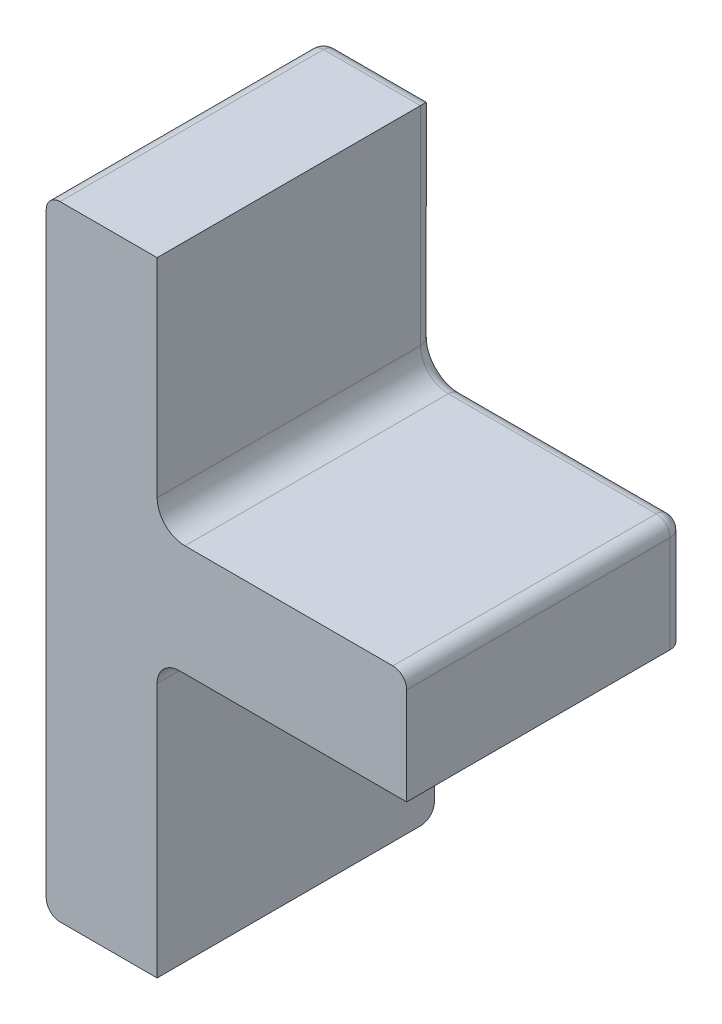
ISO-10303-21;
HEADER;
FILE_DESCRIPTION(('STEP AP214'),'2;1');
FILE_NAME('part.step','',(''),(''),'','','');
FILE_SCHEMA(('AUTOMOTIVE_DESIGN { 1 0 10303 214 1 1 1 1 }'));
ENDSEC;
DATA;
#1=APPLICATION_CONTEXT('core data for automotive mechanical design processes');
#2=APPLICATION_PROTOCOL_DEFINITION('international standard','automotive_design',2000,#1);
#3=PRODUCT_CONTEXT('',#1,'mechanical');
#4=PRODUCT('Part','Part','',(#3));
#5=PRODUCT_RELATED_PRODUCT_CATEGORY('part','',(#4));
#6=PRODUCT_DEFINITION_FORMATION('','',#4);
#7=PRODUCT_DEFINITION_CONTEXT('part definition',#1,'design');
#8=PRODUCT_DEFINITION('design','',#6,#7);
#9=PRODUCT_DEFINITION_SHAPE('','',#8);
#10=(LENGTH_UNIT() NAMED_UNIT(*) SI_UNIT(.MILLI.,.METRE.));
#11=(NAMED_UNIT(*) PLANE_ANGLE_UNIT() SI_UNIT($,.RADIAN.));
#12=(NAMED_UNIT(*) SI_UNIT($,.STERADIAN.) SOLID_ANGLE_UNIT());
#13=UNCERTAINTY_MEASURE_WITH_UNIT(LENGTH_MEASURE(1.E-05),#10,'distance_accuracy_value','');
#14=(GEOMETRIC_REPRESENTATION_CONTEXT(3) GLOBAL_UNCERTAINTY_ASSIGNED_CONTEXT((#13)) GLOBAL_UNIT_ASSIGNED_CONTEXT((#10,
#11,#12)) REPRESENTATION_CONTEXT('',''));
#15=CARTESIAN_POINT('',(0.,0.,0.));
#16=DIRECTION('',(0.,0.,1.));
#17=DIRECTION('',(1.,0.,0.));
#18=AXIS2_PLACEMENT_3D('',#15,#16,#17);
#19=CARTESIAN_POINT('',(10.16,0.,25.4));
#20=DIRECTION('',(0.,1.,0.));
#21=DIRECTION('',(0.,0.,1.));
#22=AXIS2_PLACEMENT_3D('',#19,#20,#21);
#23=PLANE('',#22);
#24=DIRECTION('',(0.,0.,-1.));
#25=VECTOR('',#24,1.);
#26=CARTESIAN_POINT('',(1.27,0.,25.4));
#27=LINE('',#26,#25);
#28=CARTESIAN_POINT('',(1.27,0.,25.4));
#29=VERTEX_POINT('',#28);
#30=CARTESIAN_POINT('',(1.27,0.,1.27));
#31=VERTEX_POINT('',#30);
#32=EDGE_CURVE('E219',#29,#31,#27,.T.);
#33=ORIENTED_EDGE('',*,*,#32,.T.);
#34=DIRECTION('',(1.,0.,0.));
#35=VECTOR('',#34,1.);
#36=CARTESIAN_POINT('',(10.16,0.,1.27));
#37=LINE('',#36,#35);
#38=CARTESIAN_POINT('',(10.16,0.,1.27));
#39=VERTEX_POINT('',#38);
#40=EDGE_CURVE('E175',#31,#39,#37,.T.);
#41=ORIENTED_EDGE('',*,*,#40,.T.);
#42=DIRECTION('',(0.,0.,-1.));
#43=VECTOR('',#42,1.);
#44=CARTESIAN_POINT('',(10.16,0.,25.4));
#45=LINE('',#44,#43);
#46=CARTESIAN_POINT('',(10.16,0.,25.4));
#47=VERTEX_POINT('',#46);
#48=EDGE_CURVE('E167',#47,#39,#45,.T.);
#49=ORIENTED_EDGE('',*,*,#48,.F.);
#50=DIRECTION('',(1.,0.,0.));
#51=VECTOR('',#50,1.);
#52=CARTESIAN_POINT('',(10.16,0.,25.4));
#53=LINE('',#52,#51);
#54=EDGE_CURVE('E150',#29,#47,#53,.T.);
#55=ORIENTED_EDGE('',*,*,#54,.F.);
#56=EDGE_LOOP('',(#33,#41,#49,#55));
#57=FACE_BOUND('',#56,.T.);
#58=ADVANCED_FACE('F33',(#57),#23,.F.);
#59=CARTESIAN_POINT('',(10.16,23.368,25.4));
#60=DIRECTION('',(-1.,0.,0.));
#61=DIRECTION('',(0.,0.,1.));
#62=AXIS2_PLACEMENT_3D('',#59,#60,#61);
#63=PLANE('',#62);
#64=ORIENTED_EDGE('',*,*,#48,.T.);
#65=CARTESIAN_POINT('',(10.16,1.27,1.27));
#66=DIRECTION('',(-1.,0.,0.));
#67=DIRECTION('',(0.,0.,1.));
#68=AXIS2_PLACEMENT_3D('',#65,#66,#67);
#69=CIRCLE('',#68,1.27);
#70=CARTESIAN_POINT('',(10.16,1.27000000000001,0.));
#71=VERTEX_POINT('',#70);
#72=EDGE_CURVE('E222',#39,#71,#69,.F.);
#73=ORIENTED_EDGE('',*,*,#72,.T.);
#74=DIRECTION('',(0.,1.,0.));
#75=VECTOR('',#74,1.);
#76=CARTESIAN_POINT('',(10.16,23.368,0.));
#77=LINE('',#76,#75);
#78=CARTESIAN_POINT('',(10.16,23.368,0.));
#79=VERTEX_POINT('',#78);
#80=EDGE_CURVE('E260',#71,#79,#77,.T.);
#81=ORIENTED_EDGE('',*,*,#80,.T.);
#82=DIRECTION('',(0.,0.,-1.));
#83=VECTOR('',#82,1.);
#84=CARTESIAN_POINT('',(10.16,23.368,25.4));
#85=LINE('',#84,#83);
#86=CARTESIAN_POINT('',(10.16,23.368,25.4));
#87=VERTEX_POINT('',#86);
#88=EDGE_CURVE('E170',#87,#79,#85,.T.);
#89=ORIENTED_EDGE('',*,*,#88,.F.);
#90=DIRECTION('',(0.,1.,0.));
#91=VECTOR('',#90,1.);
#92=CARTESIAN_POINT('',(10.16,23.368,25.4));
#93=LINE('',#92,#91);
#94=EDGE_CURVE('E154',#47,#87,#93,.T.);
#95=ORIENTED_EDGE('',*,*,#94,.F.);
#96=EDGE_LOOP('',(#64,#73,#81,#89,#95));
#97=FACE_BOUND('',#96,.T.);
#98=ADVANCED_FACE('F166',(#97),#63,.F.);
#99=CARTESIAN_POINT('',(12.192,23.368,25.4));
#100=DIRECTION('',(0.,0.,-1.));
#101=DIRECTION('',(-1.,0.,0.));
#102=AXIS2_PLACEMENT_3D('',#99,#100,#101);
#103=CYLINDRICAL_SURFACE('',#102,2.032);
#104=CARTESIAN_POINT('',(12.192,23.368,0.));
#105=DIRECTION('',(0.,0.,-1.));
#106=DIRECTION('',(1.,0.,0.));
#107=AXIS2_PLACEMENT_3D('',#104,#105,#106);
#108=CIRCLE('',#107,2.032);
#109=CARTESIAN_POINT('',(12.192,25.4,0.));
#110=VERTEX_POINT('',#109);
#111=EDGE_CURVE('E262',#79,#110,#108,.T.);
#112=ORIENTED_EDGE('',*,*,#111,.T.);
#113=DIRECTION('',(0.,0.,-1.));
#114=VECTOR('',#113,1.);
#115=CARTESIAN_POINT('',(12.192,25.4,25.4));
#116=LINE('',#115,#114);
#117=CARTESIAN_POINT('',(12.192,25.4,25.4));
#118=VERTEX_POINT('',#117);
#119=EDGE_CURVE('E181',#118,#110,#116,.T.);
#120=ORIENTED_EDGE('',*,*,#119,.F.);
#121=CARTESIAN_POINT('',(12.192,23.368,25.4));
#122=DIRECTION('',(0.,0.,-1.));
#123=DIRECTION('',(1.,0.,0.));
#124=AXIS2_PLACEMENT_3D('',#121,#122,#123);
#125=CIRCLE('',#124,2.032);
#126=EDGE_CURVE('E172',#87,#118,#125,.T.);
#127=ORIENTED_EDGE('',*,*,#126,.F.);
#128=ORIENTED_EDGE('',*,*,#88,.T.);
#129=EDGE_LOOP('',(#112,#120,#127,#128));
#130=FACE_BOUND('',#129,.T.);
#131=ADVANCED_FACE('F371',(#130),#103,.F.);
#132=CARTESIAN_POINT('',(33.02,25.4,25.4));
#133=DIRECTION('',(0.,1.,0.));
#134=DIRECTION('',(-1.,0.,0.));
#135=AXIS2_PLACEMENT_3D('',#132,#133,#134);
#136=PLANE('',#135);
#137=DIRECTION('',(1.,0.,0.));
#138=VECTOR('',#137,1.);
#139=CARTESIAN_POINT('',(33.02,25.4,0.));
#140=LINE('',#139,#138);
#141=CARTESIAN_POINT('',(31.75,25.4,0.));
#142=VERTEX_POINT('',#141);
#143=EDGE_CURVE('E162',#110,#142,#140,.T.);
#144=ORIENTED_EDGE('',*,*,#143,.T.);
#145=CARTESIAN_POINT('',(31.75,25.4,1.27));
#146=DIRECTION('',(0.,1.,0.));
#147=DIRECTION('',(-1.,0.,0.));
#148=AXIS2_PLACEMENT_3D('',#145,#146,#147);
#149=CIRCLE('',#148,1.27);
#150=CARTESIAN_POINT('',(33.02,25.4,1.27));
#151=VERTEX_POINT('',#150);
#152=EDGE_CURVE('E204',#142,#151,#149,.F.);
#153=ORIENTED_EDGE('',*,*,#152,.T.);
#154=DIRECTION('',(0.,0.,-1.));
#155=VECTOR('',#154,1.);
#156=CARTESIAN_POINT('',(33.02,25.4,25.4));
#157=LINE('',#156,#155);
#158=CARTESIAN_POINT('',(33.02,25.4,25.4));
#159=VERTEX_POINT('',#158);
#160=EDGE_CURVE('E281',#159,#151,#157,.T.);
#161=ORIENTED_EDGE('',*,*,#160,.F.);
#162=DIRECTION('',(1.,0.,0.));
#163=VECTOR('',#162,1.);
#164=CARTESIAN_POINT('',(33.02,25.4,25.4));
#165=LINE('',#164,#163);
#166=EDGE_CURVE('E291',#118,#159,#165,.T.);
#167=ORIENTED_EDGE('',*,*,#166,.F.);
#168=ORIENTED_EDGE('',*,*,#119,.T.);
#169=EDGE_LOOP('',(#144,#153,#161,#167,#168));
#170=FACE_BOUND('',#169,.T.);
#171=ADVANCED_FACE('F288',(#170),#136,.F.);
#172=CARTESIAN_POINT('',(33.02,35.56,25.4));
#173=DIRECTION('',(-1.,0.,0.));
#174=DIRECTION('',(0.,0.,1.));
#175=AXIS2_PLACEMENT_3D('',#172,#173,#174);
#176=PLANE('',#175);
#177=ORIENTED_EDGE('',*,*,#160,.T.);
#178=DIRECTION('',(0.,1.,0.));
#179=VECTOR('',#178,1.);
#180=CARTESIAN_POINT('',(33.02,35.56,1.27));
#181=LINE('',#180,#179);
#182=CARTESIAN_POINT('',(33.02,34.29,1.27));
#183=VERTEX_POINT('',#182);
#184=EDGE_CURVE('E202',#151,#183,#181,.T.);
#185=ORIENTED_EDGE('',*,*,#184,.T.);
#186=DIRECTION('',(0.,0.,-1.));
#187=VECTOR('',#186,1.);
#188=CARTESIAN_POINT('',(33.02,34.29,25.4));
#189=LINE('',#188,#187);
#190=CARTESIAN_POINT('',(33.02,34.29,25.4));
#191=VERTEX_POINT('',#190);
#192=EDGE_CURVE('E200',#183,#191,#189,.F.);
#193=ORIENTED_EDGE('',*,*,#192,.T.);
#194=DIRECTION('',(0.,1.,0.));
#195=VECTOR('',#194,1.);
#196=CARTESIAN_POINT('',(33.02,35.56,25.4));
#197=LINE('',#196,#195);
#198=EDGE_CURVE('E327',#159,#191,#197,.T.);
#199=ORIENTED_EDGE('',*,*,#198,.F.);
#200=EDGE_LOOP('',(#177,#185,#193,#199));
#201=FACE_BOUND('',#200,.T.);
#202=ADVANCED_FACE('F530',(#201),#176,.F.);
#203=CARTESIAN_POINT('',(12.7,35.56,25.4));
#204=DIRECTION('',(0.,-1.,0.));
#205=DIRECTION('',(0.,0.,-1.));
#206=AXIS2_PLACEMENT_3D('',#203,#204,#205);
#207=PLANE('',#206);
#208=DIRECTION('',(-1.,0.,0.));
#209=VECTOR('',#208,1.);
#210=CARTESIAN_POINT('',(12.7,35.56,25.4));
#211=LINE('',#210,#209);
#212=CARTESIAN_POINT('',(31.75,35.56,25.4));
#213=VERTEX_POINT('',#212);
#214=CARTESIAN_POINT('',(12.7,35.56,25.4));
#215=VERTEX_POINT('',#214);
#216=EDGE_CURVE('E323',#213,#215,#211,.T.);
#217=ORIENTED_EDGE('',*,*,#216,.F.);
#218=DIRECTION('',(0.,0.,-1.));
#219=VECTOR('',#218,1.);
#220=CARTESIAN_POINT('',(31.75,35.56,25.4));
#221=LINE('',#220,#219);
#222=CARTESIAN_POINT('',(31.75,35.56,1.27));
#223=VERTEX_POINT('',#222);
#224=EDGE_CURVE('E208',#213,#223,#221,.T.);
#225=ORIENTED_EDGE('',*,*,#224,.T.);
#226=DIRECTION('',(-1.,0.,0.));
#227=VECTOR('',#226,1.);
#228=CARTESIAN_POINT('',(12.7,35.56,1.27));
#229=LINE('',#228,#227);
#230=CARTESIAN_POINT('',(12.7,35.56,1.27));
#231=VERTEX_POINT('',#230);
#232=EDGE_CURVE('E206',#223,#231,#229,.T.);
#233=ORIENTED_EDGE('',*,*,#232,.T.);
#234=DIRECTION('',(0.,0.,-1.));
#235=VECTOR('',#234,1.);
#236=CARTESIAN_POINT('',(12.7,35.56,25.4));
#237=LINE('',#236,#235);
#238=EDGE_CURVE('E278',#215,#231,#237,.T.);
#239=ORIENTED_EDGE('',*,*,#238,.F.);
#240=EDGE_LOOP('',(#217,#225,#233,#239));
#241=FACE_BOUND('',#240,.T.);
#242=ADVANCED_FACE('F314',(#241),#207,.F.);
#243=CARTESIAN_POINT('',(12.7,38.1,25.4));
#244=DIRECTION('',(0.,0.,-1.));
#245=DIRECTION('',(-1.,0.,0.));
#246=AXIS2_PLACEMENT_3D('',#243,#244,#245);
#247=CYLINDRICAL_SURFACE('',#246,2.54);
#248=ORIENTED_EDGE('',*,*,#238,.T.);
#249=CARTESIAN_POINT('',(12.7,38.1,1.27));
#250=DIRECTION('',(0.,0.,1.));
#251=DIRECTION('',(1.,0.,0.));
#252=AXIS2_PLACEMENT_3D('',#249,#250,#251);
#253=CIRCLE('',#252,2.54);
#254=CARTESIAN_POINT('',(10.16,38.1,1.27));
#255=VERTEX_POINT('',#254);
#256=EDGE_CURVE('E198',#231,#255,#253,.F.);
#257=ORIENTED_EDGE('',*,*,#256,.T.);
#258=DIRECTION('',(0.,0.,-1.));
#259=VECTOR('',#258,1.);
#260=CARTESIAN_POINT('',(10.16,38.1,25.4));
#261=LINE('',#260,#259);
#262=CARTESIAN_POINT('',(10.16,38.1,25.4));
#263=VERTEX_POINT('',#262);
#264=EDGE_CURVE('E275',#263,#255,#261,.T.);
#265=ORIENTED_EDGE('',*,*,#264,.F.);
#266=CARTESIAN_POINT('',(12.7,38.1,25.4));
#267=DIRECTION('',(0.,0.,-1.));
#268=DIRECTION('',(1.,0.,0.));
#269=AXIS2_PLACEMENT_3D('',#266,#267,#268);
#270=CIRCLE('',#269,2.54);
#271=EDGE_CURVE('E320',#215,#263,#270,.T.);
#272=ORIENTED_EDGE('',*,*,#271,.F.);
#273=EDGE_LOOP('',(#248,#257,#265,#272));
#274=FACE_BOUND('',#273,.T.);
#275=ADVANCED_FACE('F318',(#274),#247,.F.);
#276=CARTESIAN_POINT('',(10.16,57.15,25.4));
#277=DIRECTION('',(-1.,0.,0.));
#278=DIRECTION('',(0.,-1.,0.));
#279=AXIS2_PLACEMENT_3D('',#276,#277,#278);
#280=PLANE('',#279);
#281=ORIENTED_EDGE('',*,*,#264,.T.);
#282=DIRECTION('',(0.,1.,0.));
#283=VECTOR('',#282,1.);
#284=CARTESIAN_POINT('',(10.16,57.15,1.27));
#285=LINE('',#284,#283);
#286=CARTESIAN_POINT('',(10.16,57.15,1.27));
#287=VERTEX_POINT('',#286);
#288=EDGE_CURVE('E176',#255,#287,#285,.T.);
#289=ORIENTED_EDGE('',*,*,#288,.T.);
#290=DIRECTION('',(0.,0.,-1.));
#291=VECTOR('',#290,1.);
#292=CARTESIAN_POINT('',(10.16,57.15,25.4));
#293=LINE('',#292,#291);
#294=CARTESIAN_POINT('',(10.16,57.15,25.4));
#295=VERTEX_POINT('',#294);
#296=EDGE_CURVE('E272',#295,#287,#293,.T.);
#297=ORIENTED_EDGE('',*,*,#296,.F.);
#298=DIRECTION('',(0.,1.,0.));
#299=VECTOR('',#298,1.);
#300=CARTESIAN_POINT('',(10.16,57.15,25.4));
#301=LINE('',#300,#299);
#302=EDGE_CURVE('E322',#263,#295,#301,.T.);
#303=ORIENTED_EDGE('',*,*,#302,.F.);
#304=EDGE_LOOP('',(#281,#289,#297,#303));
#305=FACE_BOUND('',#304,.T.);
#306=ADVANCED_FACE('F503',(#305),#280,.F.);
#307=CARTESIAN_POINT('',(0.,57.15,25.4));
#308=DIRECTION('',(0.,-1.,0.));
#309=DIRECTION('',(0.,0.,-1.));
#310=AXIS2_PLACEMENT_3D('',#307,#308,#309);
#311=PLANE('',#310);
#312=ORIENTED_EDGE('',*,*,#296,.T.);
#313=DIRECTION('',(-1.,0.,0.));
#314=VECTOR('',#313,1.);
#315=CARTESIAN_POINT('',(0.,57.15,1.27));
#316=LINE('',#315,#314);
#317=CARTESIAN_POINT('',(1.27,57.15,1.27));
#318=VERTEX_POINT('',#317);
#319=EDGE_CURVE('E217',#287,#318,#316,.T.);
#320=ORIENTED_EDGE('',*,*,#319,.T.);
#321=DIRECTION('',(0.,0.,-1.));
#322=VECTOR('',#321,1.);
#323=CARTESIAN_POINT('',(1.27,57.15,25.4));
#324=LINE('',#323,#322);
#325=CARTESIAN_POINT('',(1.27,57.15,25.4));
#326=VERTEX_POINT('',#325);
#327=EDGE_CURVE('E215',#318,#326,#324,.F.);
#328=ORIENTED_EDGE('',*,*,#327,.T.);
#329=DIRECTION('',(-1.,0.,0.));
#330=VECTOR('',#329,1.);
#331=CARTESIAN_POINT('',(0.,57.15,25.4));
#332=LINE('',#331,#330);
#333=EDGE_CURVE('E325',#295,#326,#332,.T.);
#334=ORIENTED_EDGE('',*,*,#333,.F.);
#335=EDGE_LOOP('',(#312,#320,#328,#334));
#336=FACE_BOUND('',#335,.T.);
#337=ADVANCED_FACE('F493',(#336),#311,.F.);
#338=CARTESIAN_POINT('',(0.,0.,25.4));
#339=DIRECTION('',(1.,0.,0.));
#340=DIRECTION('',(0.,0.,-1.));
#341=AXIS2_PLACEMENT_3D('',#338,#339,#340);
#342=PLANE('',#341);
#343=DIRECTION('',(0.,-1.,0.));
#344=VECTOR('',#343,1.);
#345=CARTESIAN_POINT('',(0.,0.,1.27));
#346=LINE('',#345,#344);
#347=CARTESIAN_POINT('',(0.,55.88,1.27));
#348=VERTEX_POINT('',#347);
#349=CARTESIAN_POINT('',(0.,1.27,1.27));
#350=VERTEX_POINT('',#349);
#351=EDGE_CURVE('E42',#348,#350,#346,.T.);
#352=ORIENTED_EDGE('',*,*,#351,.T.);
#353=DIRECTION('',(0.,0.,-1.));
#354=VECTOR('',#353,1.);
#355=CARTESIAN_POINT('',(0.,1.27,25.4));
#356=LINE('',#355,#354);
#357=CARTESIAN_POINT('',(0.,1.27,25.4));
#358=VERTEX_POINT('',#357);
#359=EDGE_CURVE('E11',#350,#358,#356,.F.);
#360=ORIENTED_EDGE('',*,*,#359,.T.);
#361=DIRECTION('',(0.,-1.,0.));
#362=VECTOR('',#361,1.);
#363=CARTESIAN_POINT('',(0.,35.56,25.4));
#364=LINE('',#363,#362);
#365=CARTESIAN_POINT('',(0.,55.88,25.4));
#366=VERTEX_POINT('',#365);
#367=EDGE_CURVE('E267',#366,#358,#364,.T.);
#368=ORIENTED_EDGE('',*,*,#367,.F.);
#369=DIRECTION('',(0.,0.,-1.));
#370=VECTOR('',#369,1.);
#371=CARTESIAN_POINT('',(0.,55.88,25.4));
#372=LINE('',#371,#370);
#373=EDGE_CURVE('E53',#366,#348,#372,.T.);
#374=ORIENTED_EDGE('',*,*,#373,.T.);
#375=EDGE_LOOP('',(#352,#360,#368,#374));
#376=FACE_BOUND('',#375,.T.);
#377=ADVANCED_FACE('F484',(#376),#342,.F.);
#378=CARTESIAN_POINT('',(12.7,38.1,25.4));
#379=DIRECTION('',(0.,0.,1.));
#380=DIRECTION('',(1.,0.,0.));
#381=AXIS2_PLACEMENT_3D('',#378,#379,#380);
#382=PLANE('',#381);
#383=ORIENTED_EDGE('',*,*,#198,.T.);
#384=CARTESIAN_POINT('',(31.75,34.29,25.4));
#385=DIRECTION('',(0.,0.,1.));
#386=DIRECTION('',(1.,0.,0.));
#387=AXIS2_PLACEMENT_3D('',#384,#385,#386);
#388=CIRCLE('',#387,1.27);
#389=EDGE_CURVE('E213',#191,#213,#388,.T.);
#390=ORIENTED_EDGE('',*,*,#389,.T.);
#391=ORIENTED_EDGE('',*,*,#216,.T.);
#392=ORIENTED_EDGE('',*,*,#271,.T.);
#393=ORIENTED_EDGE('',*,*,#302,.T.);
#394=ORIENTED_EDGE('',*,*,#333,.T.);
#395=CARTESIAN_POINT('',(1.27,55.88,25.4));
#396=DIRECTION('',(0.,0.,1.));
#397=DIRECTION('',(1.,0.,0.));
#398=AXIS2_PLACEMENT_3D('',#395,#396,#397);
#399=CIRCLE('',#398,1.27);
#400=EDGE_CURVE('E210',#326,#366,#399,.T.);
#401=ORIENTED_EDGE('',*,*,#400,.T.);
#402=ORIENTED_EDGE('',*,*,#367,.T.);
#403=CARTESIAN_POINT('',(1.27,1.27,25.4));
#404=DIRECTION('',(0.,0.,1.));
#405=DIRECTION('',(1.,0.,0.));
#406=AXIS2_PLACEMENT_3D('',#403,#404,#405);
#407=CIRCLE('',#406,1.27);
#408=EDGE_CURVE('E158',#358,#29,#407,.T.);
#409=ORIENTED_EDGE('',*,*,#408,.T.);
#410=ORIENTED_EDGE('',*,*,#54,.T.);
#411=ORIENTED_EDGE('',*,*,#94,.T.);
#412=ORIENTED_EDGE('',*,*,#126,.T.);
#413=ORIENTED_EDGE('',*,*,#166,.T.);
#414=EDGE_LOOP('',(#383,#390,#391,#392,#393,#394,#401,#402,#409,#410,#411,#412,#413));
#415=FACE_BOUND('',#414,.T.);
#416=ADVANCED_FACE('F153',(#415),#382,.T.);
#417=CARTESIAN_POINT('',(12.7,38.1,0.));
#418=DIRECTION('',(0.,0.,1.));
#419=DIRECTION('',(1.,0.,0.));
#420=AXIS2_PLACEMENT_3D('',#417,#418,#419);
#421=PLANE('',#420);
#422=DIRECTION('',(-1.,0.,0.));
#423=VECTOR('',#422,1.);
#424=CARTESIAN_POINT('',(12.7,34.29,0.));
#425=LINE('',#424,#423);
#426=CARTESIAN_POINT('',(12.7,34.29,0.));
#427=VERTEX_POINT('',#426);
#428=CARTESIAN_POINT('',(31.75,34.29,0.));
#429=VERTEX_POINT('',#428);
#430=EDGE_CURVE('E194',#427,#429,#425,.F.);
#431=ORIENTED_EDGE('',*,*,#430,.T.);
#432=DIRECTION('',(0.,1.,0.));
#433=VECTOR('',#432,1.);
#434=CARTESIAN_POINT('',(31.75,38.1,0.));
#435=LINE('',#434,#433);
#436=EDGE_CURVE('E196',#429,#142,#435,.F.);
#437=ORIENTED_EDGE('',*,*,#436,.T.);
#438=ORIENTED_EDGE('',*,*,#143,.F.);
#439=ORIENTED_EDGE('',*,*,#111,.F.);
#440=ORIENTED_EDGE('',*,*,#80,.F.);
#441=DIRECTION('',(1.,0.,0.));
#442=VECTOR('',#441,1.);
#443=CARTESIAN_POINT('',(12.7,1.27,0.));
#444=LINE('',#443,#442);
#445=CARTESIAN_POINT('',(1.27,1.27,0.));
#446=VERTEX_POINT('',#445);
#447=EDGE_CURVE('E186',#71,#446,#444,.F.);
#448=ORIENTED_EDGE('',*,*,#447,.T.);
#449=DIRECTION('',(0.,-1.,0.));
#450=VECTOR('',#449,1.);
#451=CARTESIAN_POINT('',(1.27,38.1,0.));
#452=LINE('',#451,#450);
#453=CARTESIAN_POINT('',(1.27,55.88,0.));
#454=VERTEX_POINT('',#453);
#455=EDGE_CURVE('E179',#446,#454,#452,.F.);
#456=ORIENTED_EDGE('',*,*,#455,.T.);
#457=DIRECTION('',(-1.,0.,0.));
#458=VECTOR('',#457,1.);
#459=CARTESIAN_POINT('',(12.7,55.88,0.));
#460=LINE('',#459,#458);
#461=CARTESIAN_POINT('',(8.89,55.88,0.));
#462=VERTEX_POINT('',#461);
#463=EDGE_CURVE('E188',#454,#462,#460,.F.);
#464=ORIENTED_EDGE('',*,*,#463,.T.);
#465=DIRECTION('',(0.,1.,0.));
#466=VECTOR('',#465,1.);
#467=CARTESIAN_POINT('',(8.89,38.1,0.));
#468=LINE('',#467,#466);
#469=CARTESIAN_POINT('',(8.89,38.1,0.));
#470=VERTEX_POINT('',#469);
#471=EDGE_CURVE('E190',#462,#470,#468,.F.);
#472=ORIENTED_EDGE('',*,*,#471,.T.);
#473=CARTESIAN_POINT('',(12.7,38.1,0.));
#474=DIRECTION('',(0.,0.,1.));
#475=DIRECTION('',(1.,0.,0.));
#476=AXIS2_PLACEMENT_3D('',#473,#474,#475);
#477=CIRCLE('',#476,3.81);
#478=EDGE_CURVE('E192',#470,#427,#477,.T.);
#479=ORIENTED_EDGE('',*,*,#478,.T.);
#480=EDGE_LOOP('',(#431,#437,#438,#439,#440,#448,#456,#464,#472,#479));
#481=FACE_BOUND('',#480,.T.);
#482=ADVANCED_FACE('F295',(#481),#421,.F.);
#483=CARTESIAN_POINT('',(1.27,1.27,25.4));
#484=DIRECTION('',(0.,0.,-1.));
#485=DIRECTION('',(-1.,0.,0.));
#486=AXIS2_PLACEMENT_3D('',#483,#484,#485);
#487=CYLINDRICAL_SURFACE('',#486,1.27);
#488=ORIENTED_EDGE('',*,*,#408,.F.);
#489=ORIENTED_EDGE('',*,*,#359,.F.);
#490=CARTESIAN_POINT('',(1.27,1.27,1.27));
#491=DIRECTION('',(0.,0.,-1.));
#492=DIRECTION('',(-1.,0.,0.));
#493=AXIS2_PLACEMENT_3D('',#490,#491,#492);
#494=CIRCLE('',#493,1.27);
#495=EDGE_CURVE('E37',#31,#350,#494,.T.);
#496=ORIENTED_EDGE('',*,*,#495,.F.);
#497=ORIENTED_EDGE('',*,*,#32,.F.);
#498=EDGE_LOOP('',(#488,#489,#496,#497));
#499=FACE_BOUND('',#498,.T.);
#500=ADVANCED_FACE('F35',(#499),#487,.T.);
#501=CARTESIAN_POINT('',(10.16,1.27,1.27));
#502=DIRECTION('',(1.,0.,0.));
#503=DIRECTION('',(0.,0.,-1.));
#504=AXIS2_PLACEMENT_3D('',#501,#502,#503);
#505=CYLINDRICAL_SURFACE('',#504,1.27);
#506=ORIENTED_EDGE('',*,*,#72,.F.);
#507=ORIENTED_EDGE('',*,*,#40,.F.);
#508=CARTESIAN_POINT('',(1.27,1.27,1.27));
#509=DIRECTION('',(-1.,0.,0.));
#510=DIRECTION('',(0.,-1.,0.));
#511=AXIS2_PLACEMENT_3D('',#508,#509,#510);
#512=CIRCLE('',#511,1.27);
#513=EDGE_CURVE('E254',#446,#31,#512,.T.);
#514=ORIENTED_EDGE('',*,*,#513,.F.);
#515=ORIENTED_EDGE('',*,*,#447,.F.);
#516=EDGE_LOOP('',(#506,#507,#514,#515));
#517=FACE_BOUND('',#516,.T.);
#518=ADVANCED_FACE('F335',(#517),#505,.T.);
#519=CARTESIAN_POINT('',(31.75,35.56,1.27));
#520=DIRECTION('',(0.,1.,0.));
#521=DIRECTION('',(0.,0.,1.));
#522=AXIS2_PLACEMENT_3D('',#519,#520,#521);
#523=CYLINDRICAL_SURFACE('',#522,1.27);
#524=ORIENTED_EDGE('',*,*,#152,.F.);
#525=ORIENTED_EDGE('',*,*,#436,.F.);
#526=CARTESIAN_POINT('',(31.75,34.29,1.27));
#527=DIRECTION('',(0.,1.,0.));
#528=DIRECTION('',(0.,0.,1.));
#529=AXIS2_PLACEMENT_3D('',#526,#527,#528);
#530=CIRCLE('',#529,1.27);
#531=EDGE_CURVE('E252',#183,#429,#530,.T.);
#532=ORIENTED_EDGE('',*,*,#531,.F.);
#533=ORIENTED_EDGE('',*,*,#184,.F.);
#534=EDGE_LOOP('',(#524,#525,#532,#533));
#535=FACE_BOUND('',#534,.T.);
#536=ADVANCED_FACE('F300',(#535),#523,.T.);
#537=CARTESIAN_POINT('',(31.75,34.29,25.4));
#538=DIRECTION('',(0.,0.,-1.));
#539=DIRECTION('',(-1.,0.,0.));
#540=AXIS2_PLACEMENT_3D('',#537,#538,#539);
#541=CYLINDRICAL_SURFACE('',#540,1.27);
#542=ORIENTED_EDGE('',*,*,#389,.F.);
#543=ORIENTED_EDGE('',*,*,#192,.F.);
#544=CARTESIAN_POINT('',(31.75,34.29,1.27));
#545=DIRECTION('',(0.,0.,-1.));
#546=DIRECTION('',(-1.,0.,0.));
#547=AXIS2_PLACEMENT_3D('',#544,#545,#546);
#548=CIRCLE('',#547,1.27);
#549=EDGE_CURVE('E249',#223,#183,#548,.T.);
#550=ORIENTED_EDGE('',*,*,#549,.F.);
#551=ORIENTED_EDGE('',*,*,#224,.F.);
#552=EDGE_LOOP('',(#542,#543,#550,#551));
#553=FACE_BOUND('',#552,.T.);
#554=ADVANCED_FACE('F436',(#553),#541,.T.);
#555=CARTESIAN_POINT('',(1.27,1.27,1.27));
#556=DIRECTION('',(0.,0.,1.));
#557=DIRECTION('',(1.,0.,0.));
#558=AXIS2_PLACEMENT_3D('',#555,#556,#557);
#559=SPHERICAL_SURFACE('',#558,1.27);
#560=ORIENTED_EDGE('',*,*,#513,.T.);
#561=ORIENTED_EDGE('',*,*,#495,.T.);
#562=CARTESIAN_POINT('',(1.27,1.27,1.27));
#563=DIRECTION('',(0.,-1.,0.));
#564=DIRECTION('',(0.,0.,-1.));
#565=AXIS2_PLACEMENT_3D('',#562,#563,#564);
#566=CIRCLE('',#565,1.27);
#567=EDGE_CURVE('E246',#446,#350,#566,.F.);
#568=ORIENTED_EDGE('',*,*,#567,.F.);
#569=EDGE_LOOP('',(#560,#561,#568));
#570=FACE_BOUND('',#569,.T.);
#571=ADVANCED_FACE('F427',(#570),#559,.T.);
#572=CARTESIAN_POINT('',(31.75,34.29,1.27));
#573=DIRECTION('',(0.,0.,1.));
#574=DIRECTION('',(1.,0.,0.));
#575=AXIS2_PLACEMENT_3D('',#572,#573,#574);
#576=SPHERICAL_SURFACE('',#575,1.27);
#577=ORIENTED_EDGE('',*,*,#549,.T.);
#578=ORIENTED_EDGE('',*,*,#531,.T.);
#579=CARTESIAN_POINT('',(31.75,34.29,1.27));
#580=DIRECTION('',(1.,0.,0.));
#581=DIRECTION('',(0.,0.,-1.));
#582=AXIS2_PLACEMENT_3D('',#579,#580,#581);
#583=CIRCLE('',#582,1.27);
#584=EDGE_CURVE('E243',#223,#429,#583,.F.);
#585=ORIENTED_EDGE('',*,*,#584,.F.);
#586=EDGE_LOOP('',(#577,#578,#585));
#587=FACE_BOUND('',#586,.T.);
#588=ADVANCED_FACE('F304',(#587),#576,.T.);
#589=CARTESIAN_POINT('',(1.27,55.88,25.4));
#590=DIRECTION('',(0.,0.,-1.));
#591=DIRECTION('',(-1.,0.,0.));
#592=AXIS2_PLACEMENT_3D('',#589,#590,#591);
#593=CYLINDRICAL_SURFACE('',#592,1.27);
#594=ORIENTED_EDGE('',*,*,#400,.F.);
#595=ORIENTED_EDGE('',*,*,#327,.F.);
#596=CARTESIAN_POINT('',(1.27,55.88,1.27));
#597=DIRECTION('',(0.,0.,-1.));
#598=DIRECTION('',(-1.,0.,0.));
#599=AXIS2_PLACEMENT_3D('',#596,#597,#598);
#600=CIRCLE('',#599,1.27);
#601=EDGE_CURVE('E240',#348,#318,#600,.T.);
#602=ORIENTED_EDGE('',*,*,#601,.F.);
#603=ORIENTED_EDGE('',*,*,#373,.F.);
#604=EDGE_LOOP('',(#594,#595,#602,#603));
#605=FACE_BOUND('',#604,.T.);
#606=ADVANCED_FACE('F409',(#605),#593,.T.);
#607=CARTESIAN_POINT('',(1.27,0.,1.27));
#608=DIRECTION('',(0.,-1.,0.));
#609=DIRECTION('',(0.,0.,-1.));
#610=AXIS2_PLACEMENT_3D('',#607,#608,#609);
#611=CYLINDRICAL_SURFACE('',#610,1.27);
#612=ORIENTED_EDGE('',*,*,#567,.T.);
#613=ORIENTED_EDGE('',*,*,#351,.F.);
#614=CARTESIAN_POINT('',(1.27,55.88,1.27));
#615=DIRECTION('',(0.,1.,0.));
#616=DIRECTION('',(0.,0.,1.));
#617=AXIS2_PLACEMENT_3D('',#614,#615,#616);
#618=CIRCLE('',#617,1.27);
#619=EDGE_CURVE('E237',#454,#348,#618,.T.);
#620=ORIENTED_EDGE('',*,*,#619,.F.);
#621=ORIENTED_EDGE('',*,*,#455,.F.);
#622=EDGE_LOOP('',(#612,#613,#620,#621));
#623=FACE_BOUND('',#622,.T.);
#624=ADVANCED_FACE('F343',(#623),#611,.T.);
#625=CARTESIAN_POINT('',(12.7,34.29,1.27));
#626=DIRECTION('',(-1.,0.,0.));
#627=DIRECTION('',(0.,0.,1.));
#628=AXIS2_PLACEMENT_3D('',#625,#626,#627);
#629=CYLINDRICAL_SURFACE('',#628,1.27);
#630=ORIENTED_EDGE('',*,*,#584,.T.);
#631=ORIENTED_EDGE('',*,*,#430,.F.);
#632=CARTESIAN_POINT('',(12.7,34.29,1.27));
#633=DIRECTION('',(-1.,0.,0.));
#634=DIRECTION('',(0.,0.,1.));
#635=AXIS2_PLACEMENT_3D('',#632,#633,#634);
#636=CIRCLE('',#635,1.27);
#637=EDGE_CURVE('E234',#231,#427,#636,.T.);
#638=ORIENTED_EDGE('',*,*,#637,.F.);
#639=ORIENTED_EDGE('',*,*,#232,.F.);
#640=EDGE_LOOP('',(#630,#631,#638,#639));
#641=FACE_BOUND('',#640,.T.);
#642=ADVANCED_FACE('F308',(#641),#629,.T.);
#643=CARTESIAN_POINT('',(1.27,55.88,1.27));
#644=DIRECTION('',(0.,0.,1.));
#645=DIRECTION('',(1.,0.,0.));
#646=AXIS2_PLACEMENT_3D('',#643,#644,#645);
#647=SPHERICAL_SURFACE('',#646,1.27);
#648=ORIENTED_EDGE('',*,*,#619,.T.);
#649=ORIENTED_EDGE('',*,*,#601,.T.);
#650=CARTESIAN_POINT('',(1.27,55.88,1.27));
#651=DIRECTION('',(-1.,0.,0.));
#652=DIRECTION('',(0.,0.,1.));
#653=AXIS2_PLACEMENT_3D('',#650,#651,#652);
#654=CIRCLE('',#653,1.27);
#655=EDGE_CURVE('E231',#454,#318,#654,.F.);
#656=ORIENTED_EDGE('',*,*,#655,.F.);
#657=EDGE_LOOP('',(#648,#649,#656));
#658=FACE_BOUND('',#657,.T.);
#659=ADVANCED_FACE('F346',(#658),#647,.T.);
#660=CARTESIAN_POINT('',(12.7,38.1,1.27));
#661=DIRECTION('',(0.,0.,1.));
#662=DIRECTION('',(1.,0.,0.));
#663=AXIS2_PLACEMENT_3D('',#660,#661,#662);
#664=TOROIDAL_SURFACE('',#663,3.81,1.27);
#665=ORIENTED_EDGE('',*,*,#637,.T.);
#666=ORIENTED_EDGE('',*,*,#478,.F.);
#667=CARTESIAN_POINT('',(8.89,38.1,1.27));
#668=DIRECTION('',(0.,1.,0.));
#669=DIRECTION('',(0.,0.,1.));
#670=AXIS2_PLACEMENT_3D('',#667,#668,#669);
#671=CIRCLE('',#670,1.27);
#672=EDGE_CURVE('E228',#255,#470,#671,.T.);
#673=ORIENTED_EDGE('',*,*,#672,.F.);
#674=ORIENTED_EDGE('',*,*,#256,.F.);
#675=EDGE_LOOP('',(#665,#666,#673,#674));
#676=FACE_BOUND('',#675,.T.);
#677=ADVANCED_FACE('F357',(#676),#664,.T.);
#678=CARTESIAN_POINT('',(0.,55.88,1.27));
#679=DIRECTION('',(-1.,0.,0.));
#680=DIRECTION('',(0.,0.,1.));
#681=AXIS2_PLACEMENT_3D('',#678,#679,#680);
#682=CYLINDRICAL_SURFACE('',#681,1.27);
#683=ORIENTED_EDGE('',*,*,#655,.T.);
#684=ORIENTED_EDGE('',*,*,#319,.F.);
#685=CARTESIAN_POINT('',(8.89,55.88,1.27));
#686=DIRECTION('',(-0.707106781186547,0.707106781186548,0.));
#687=DIRECTION('',(-0.707106781186547,-0.707106781186547,0.));
#688=AXIS2_PLACEMENT_3D('',#685,#686,#687);
#689=ELLIPSE('',#688,1.79605122421383,1.27);
#690=EDGE_CURVE('E226',#462,#287,#689,.F.);
#691=ORIENTED_EDGE('',*,*,#690,.F.);
#692=ORIENTED_EDGE('',*,*,#463,.F.);
#693=EDGE_LOOP('',(#683,#684,#691,#692));
#694=FACE_BOUND('',#693,.T.);
#695=ADVANCED_FACE('F350',(#694),#682,.T.);
#696=CARTESIAN_POINT('',(8.89,57.15,1.27));
#697=DIRECTION('',(0.,1.,0.));
#698=DIRECTION('',(-1.,0.,0.));
#699=AXIS2_PLACEMENT_3D('',#696,#697,#698);
#700=CYLINDRICAL_SURFACE('',#699,1.27);
#701=ORIENTED_EDGE('',*,*,#672,.T.);
#702=ORIENTED_EDGE('',*,*,#471,.F.);
#703=ORIENTED_EDGE('',*,*,#690,.T.);
#704=ORIENTED_EDGE('',*,*,#288,.F.);
#705=EDGE_LOOP('',(#701,#702,#703,#704));
#706=FACE_BOUND('',#705,.T.);
#707=ADVANCED_FACE('F353',(#706),#700,.T.);
#708=CLOSED_SHELL('',(#58,#98,#131,#171,#202,#242,#275,#306,#337,#377,#416,#482,#500,#518,#536,
#554,#571,#588,#606,#624,#642,#659,#677,#695,#707));
#709=MANIFOLD_SOLID_BREP('B2',#708);
#710=ADVANCED_BREP_SHAPE_REPRESENTATION('',(#18,#709),#14);
#711=SHAPE_DEFINITION_REPRESENTATION(#9,#710);
ENDSEC;
END-ISO-10303-21;
